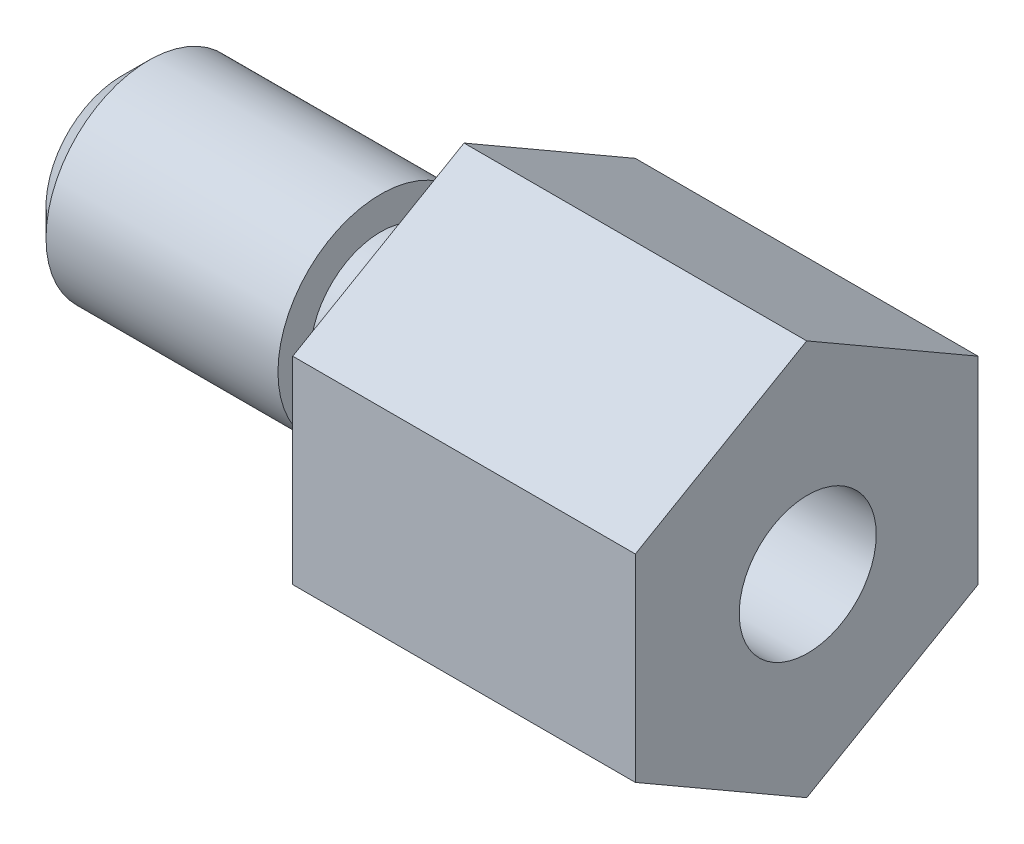
ISO-10303-21;
HEADER;
FILE_DESCRIPTION(('STEP AP214'),'2;1');
FILE_NAME('part.step','',(''),(''),'','','');
FILE_SCHEMA(('AUTOMOTIVE_DESIGN { 1 0 10303 214 1 1 1 1 }'));
ENDSEC;
DATA;
#1=APPLICATION_CONTEXT('core data for automotive mechanical design processes');
#2=APPLICATION_PROTOCOL_DEFINITION('international standard','automotive_design',2000,#1);
#3=PRODUCT_CONTEXT('',#1,'mechanical');
#4=PRODUCT('Part','Part','',(#3));
#5=PRODUCT_RELATED_PRODUCT_CATEGORY('part','',(#4));
#6=PRODUCT_DEFINITION_FORMATION('','',#4);
#7=PRODUCT_DEFINITION_CONTEXT('part definition',#1,'design');
#8=PRODUCT_DEFINITION('design','',#6,#7);
#9=PRODUCT_DEFINITION_SHAPE('','',#8);
#10=(LENGTH_UNIT() NAMED_UNIT(*) SI_UNIT(.MILLI.,.METRE.));
#11=(NAMED_UNIT(*) PLANE_ANGLE_UNIT() SI_UNIT($,.RADIAN.));
#12=(NAMED_UNIT(*) SI_UNIT($,.STERADIAN.) SOLID_ANGLE_UNIT());
#13=UNCERTAINTY_MEASURE_WITH_UNIT(LENGTH_MEASURE(1.E-05),#10,'distance_accuracy_value','');
#14=(GEOMETRIC_REPRESENTATION_CONTEXT(3) GLOBAL_UNCERTAINTY_ASSIGNED_CONTEXT((#13)) GLOBAL_UNIT_ASSIGNED_CONTEXT((#10,
#11,#12)) REPRESENTATION_CONTEXT('',''));
#15=CARTESIAN_POINT('',(0.,0.,0.));
#16=DIRECTION('',(0.,0.,1.));
#17=DIRECTION('',(1.,0.,0.));
#18=AXIS2_PLACEMENT_3D('',#15,#16,#17);
#19=CARTESIAN_POINT('',(5.,2.8867513453525,7.0548752704807E-10));
#20=DIRECTION('',(0.,0.866025403784439,-0.5));
#21=DIRECTION('',(0.,0.5,0.866025403784439));
#22=AXIS2_PLACEMENT_3D('',#19,#20,#21);
#23=PLANE('',#22);
#24=DIRECTION('',(0.,-0.5,-0.866025403784439));
#25=VECTOR('',#24,1.);
#26=CARTESIAN_POINT('',(0.,2.8867513453525,7.0548752704807E-10));
#27=LINE('',#26,#25);
#28=CARTESIAN_POINT('',(0.,2.8867513453525,7.0548752704807E-10));
#29=VERTEX_POINT('',#28);
#30=CARTESIAN_POINT('',(0.,1.44337567207295,-2.49999999982363));
#31=VERTEX_POINT('',#30);
#32=EDGE_CURVE('E128',#29,#31,#27,.T.);
#33=ORIENTED_EDGE('',*,*,#32,.F.);
#34=DIRECTION('',(-1.,0.,0.));
#35=VECTOR('',#34,1.);
#36=CARTESIAN_POINT('',(5.,2.8867513453525,7.0548752704807E-10));
#37=LINE('',#36,#35);
#38=CARTESIAN_POINT('',(5.,2.8867513453525,7.0548752704807E-10));
#39=VERTEX_POINT('',#38);
#40=EDGE_CURVE('E134',#39,#29,#37,.T.);
#41=ORIENTED_EDGE('',*,*,#40,.F.);
#42=DIRECTION('',(0.,-0.5,-0.866025403784439));
#43=VECTOR('',#42,1.);
#44=CARTESIAN_POINT('',(5.,2.8867513453525,7.0548752704807E-10));
#45=LINE('',#44,#43);
#46=CARTESIAN_POINT('',(5.,1.44337567207295,-2.49999999982363));
#47=VERTEX_POINT('',#46);
#48=EDGE_CURVE('E135',#39,#47,#45,.T.);
#49=ORIENTED_EDGE('',*,*,#48,.T.);
#50=DIRECTION('',(-1.,0.,0.));
#51=VECTOR('',#50,1.);
#52=CARTESIAN_POINT('',(5.,1.44337567207295,-2.49999999982363));
#53=LINE('',#52,#51);
#54=EDGE_CURVE('E154',#47,#31,#53,.T.);
#55=ORIENTED_EDGE('',*,*,#54,.T.);
#56=EDGE_LOOP('',(#33,#41,#49,#55));
#57=FACE_BOUND('',#56,.T.);
#58=ADVANCED_FACE('F33',(#57),#23,.T.);
#59=CARTESIAN_POINT('',(5.,1.44337567268392,2.50000000017637));
#60=DIRECTION('',(0.,0.866025403784439,0.5));
#61=DIRECTION('',(0.,-0.5,0.866025403784439));
#62=AXIS2_PLACEMENT_3D('',#59,#60,#61);
#63=PLANE('',#62);
#64=DIRECTION('',(0.,0.5,-0.866025403784439));
#65=VECTOR('',#64,1.);
#66=CARTESIAN_POINT('',(0.,1.44337567268392,2.50000000017637));
#67=LINE('',#66,#65);
#68=CARTESIAN_POINT('',(0.,1.44337567268392,2.50000000017637));
#69=VERTEX_POINT('',#68);
#70=EDGE_CURVE('E139',#69,#29,#67,.T.);
#71=ORIENTED_EDGE('',*,*,#70,.F.);
#72=DIRECTION('',(-1.,0.,0.));
#73=VECTOR('',#72,1.);
#74=CARTESIAN_POINT('',(5.,1.44337567268392,2.50000000017637));
#75=LINE('',#74,#73);
#76=CARTESIAN_POINT('',(5.,1.44337567268392,2.50000000017637));
#77=VERTEX_POINT('',#76);
#78=EDGE_CURVE('E172',#77,#69,#75,.T.);
#79=ORIENTED_EDGE('',*,*,#78,.F.);
#80=DIRECTION('',(0.,0.5,-0.866025403784439));
#81=VECTOR('',#80,1.);
#82=CARTESIAN_POINT('',(5.,1.44337567268392,2.50000000017637));
#83=LINE('',#82,#81);
#84=EDGE_CURVE('E151',#77,#39,#83,.T.);
#85=ORIENTED_EDGE('',*,*,#84,.T.);
#86=ORIENTED_EDGE('',*,*,#40,.T.);
#87=EDGE_LOOP('',(#71,#79,#85,#86));
#88=FACE_BOUND('',#87,.T.);
#89=ADVANCED_FACE('F210',(#88),#63,.T.);
#90=CARTESIAN_POINT('',(5.,-1.44337567307589,2.50000000017637));
#91=DIRECTION('',(0.,0.,1.));
#92=DIRECTION('',(0.,-1.,0.));
#93=AXIS2_PLACEMENT_3D('',#90,#91,#92);
#94=PLANE('',#93);
#95=DIRECTION('',(0.,1.,0.));
#96=VECTOR('',#95,1.);
#97=CARTESIAN_POINT('',(0.,-1.44337567307589,2.50000000017637));
#98=LINE('',#97,#96);
#99=CARTESIAN_POINT('',(0.,-1.44337567307589,2.50000000017637));
#100=VERTEX_POINT('',#99);
#101=EDGE_CURVE('E166',#100,#69,#98,.T.);
#102=ORIENTED_EDGE('',*,*,#101,.F.);
#103=DIRECTION('',(-1.,0.,0.));
#104=VECTOR('',#103,1.);
#105=CARTESIAN_POINT('',(5.,-1.44337567307589,2.50000000017637));
#106=LINE('',#105,#104);
#107=CARTESIAN_POINT('',(5.,-1.44337567307589,2.50000000017637));
#108=VERTEX_POINT('',#107);
#109=EDGE_CURVE('E174',#108,#100,#106,.T.);
#110=ORIENTED_EDGE('',*,*,#109,.F.);
#111=DIRECTION('',(0.,1.,0.));
#112=VECTOR('',#111,1.);
#113=CARTESIAN_POINT('',(5.,-1.44337567307589,2.50000000017637));
#114=LINE('',#113,#112);
#115=EDGE_CURVE('E148',#108,#77,#114,.T.);
#116=ORIENTED_EDGE('',*,*,#115,.T.);
#117=ORIENTED_EDGE('',*,*,#78,.T.);
#118=EDGE_LOOP('',(#102,#110,#116,#117));
#119=FACE_BOUND('',#118,.T.);
#120=ADVANCED_FACE('F213',(#119),#94,.T.);
#121=CARTESIAN_POINT('',(5.,-2.88675134696641,7.05487527048071E-10));
#122=DIRECTION('',(0.,-0.866025403601148,0.500000000317469));
#123=DIRECTION('',(0.,-0.500000000317469,-0.866025403601148));
#124=AXIS2_PLACEMENT_3D('',#121,#122,#123);
#125=PLANE('',#124);
#126=DIRECTION('',(0.,0.500000000317469,0.866025403601148));
#127=VECTOR('',#126,1.);
#128=CARTESIAN_POINT('',(0.,-2.88675134696641,7.05487527048071E-10));
#129=LINE('',#128,#127);
#130=CARTESIAN_POINT('',(0.,-2.88675134696641,7.05487527048071E-10));
#131=VERTEX_POINT('',#130);
#132=EDGE_CURVE('E163',#131,#100,#129,.T.);
#133=ORIENTED_EDGE('',*,*,#132,.F.);
#134=DIRECTION('',(-1.,0.,0.));
#135=VECTOR('',#134,1.);
#136=CARTESIAN_POINT('',(5.,-2.88675134696641,7.05487527048071E-10));
#137=LINE('',#136,#135);
#138=CARTESIAN_POINT('',(5.,-2.88675134696641,7.05487527048071E-10));
#139=VERTEX_POINT('',#138);
#140=EDGE_CURVE('E176',#139,#131,#137,.T.);
#141=ORIENTED_EDGE('',*,*,#140,.F.);
#142=DIRECTION('',(0.,0.500000000317469,0.866025403601148));
#143=VECTOR('',#142,1.);
#144=CARTESIAN_POINT('',(5.,-2.88675134696641,7.05487527048071E-10));
#145=LINE('',#144,#143);
#146=EDGE_CURVE('E145',#139,#108,#145,.T.);
#147=ORIENTED_EDGE('',*,*,#146,.T.);
#148=ORIENTED_EDGE('',*,*,#109,.T.);
#149=EDGE_LOOP('',(#133,#141,#147,#148));
#150=FACE_BOUND('',#149,.T.);
#151=ADVANCED_FACE('F217',(#150),#125,.T.);
#152=CARTESIAN_POINT('',(5.,-1.44337567368686,-2.49999999982363));
#153=DIRECTION('',(0.,-0.866025403784439,-0.5));
#154=DIRECTION('',(0.,0.5,-0.866025403784439));
#155=AXIS2_PLACEMENT_3D('',#152,#153,#154);
#156=PLANE('',#155);
#157=DIRECTION('',(0.,-0.5,0.866025403784439));
#158=VECTOR('',#157,1.);
#159=CARTESIAN_POINT('',(0.,-1.44337567368686,-2.49999999982363));
#160=LINE('',#159,#158);
#161=CARTESIAN_POINT('',(0.,-1.44337567368686,-2.49999999982363));
#162=VERTEX_POINT('',#161);
#163=EDGE_CURVE('E160',#162,#131,#160,.T.);
#164=ORIENTED_EDGE('',*,*,#163,.F.);
#165=DIRECTION('',(-1.,0.,0.));
#166=VECTOR('',#165,1.);
#167=CARTESIAN_POINT('',(5.,-1.44337567368686,-2.49999999982363));
#168=LINE('',#167,#166);
#169=CARTESIAN_POINT('',(5.,-1.44337567368686,-2.49999999982363));
#170=VERTEX_POINT('',#169);
#171=EDGE_CURVE('E178',#170,#162,#168,.T.);
#172=ORIENTED_EDGE('',*,*,#171,.F.);
#173=DIRECTION('',(0.,-0.5,0.866025403784439));
#174=VECTOR('',#173,1.);
#175=CARTESIAN_POINT('',(5.,-1.44337567368686,-2.49999999982363));
#176=LINE('',#175,#174);
#177=EDGE_CURVE('E142',#170,#139,#176,.T.);
#178=ORIENTED_EDGE('',*,*,#177,.T.);
#179=ORIENTED_EDGE('',*,*,#140,.T.);
#180=EDGE_LOOP('',(#164,#172,#178,#179));
#181=FACE_BOUND('',#180,.T.);
#182=ADVANCED_FACE('F221',(#181),#156,.T.);
#183=CARTESIAN_POINT('',(5.,1.44337567207295,-2.49999999982363));
#184=DIRECTION('',(0.,0.,-1.));
#185=DIRECTION('',(-1.,0.,0.));
#186=AXIS2_PLACEMENT_3D('',#183,#184,#185);
#187=PLANE('',#186);
#188=DIRECTION('',(0.,-1.,0.));
#189=VECTOR('',#188,1.);
#190=CARTESIAN_POINT('',(0.,1.44337567207295,-2.49999999982363));
#191=LINE('',#190,#189);
#192=EDGE_CURVE('E157',#31,#162,#191,.T.);
#193=ORIENTED_EDGE('',*,*,#192,.F.);
#194=ORIENTED_EDGE('',*,*,#54,.F.);
#195=DIRECTION('',(0.,-1.,0.));
#196=VECTOR('',#195,1.);
#197=CARTESIAN_POINT('',(5.,1.44337567207295,-2.49999999982363));
#198=LINE('',#197,#196);
#199=EDGE_CURVE('E138',#47,#170,#198,.T.);
#200=ORIENTED_EDGE('',*,*,#199,.T.);
#201=ORIENTED_EDGE('',*,*,#171,.T.);
#202=EDGE_LOOP('',(#193,#194,#200,#201));
#203=FACE_BOUND('',#202,.T.);
#204=ADVANCED_FACE('F205',(#203),#187,.T.);
#205=CARTESIAN_POINT('',(5.,0.,0.));
#206=DIRECTION('',(-1.,0.,0.));
#207=DIRECTION('',(0.,0.,1.));
#208=AXIS2_PLACEMENT_3D('',#205,#206,#207);
#209=PLANE('',#208);
#210=CARTESIAN_POINT('',(5.,-0.068295067,-0.0152284159999954));
#211=DIRECTION('',(1.,0.,0.));
#212=DIRECTION('',(0.,0.,-1.));
#213=AXIS2_PLACEMENT_3D('',#210,#211,#212);
#214=CIRCLE('',#213,0.999999999999999);
#215=CARTESIAN_POINT('',(5.,-0.068295067,-1.01522841599999));
#216=VERTEX_POINT('',#215);
#217=EDGE_CURVE('E335',#216,#216,#214,.T.);
#218=ORIENTED_EDGE('',*,*,#217,.F.);
#219=EDGE_LOOP('',(#218));
#220=FACE_BOUND('',#219,.T.);
#221=ORIENTED_EDGE('',*,*,#48,.F.);
#222=ORIENTED_EDGE('',*,*,#84,.F.);
#223=ORIENTED_EDGE('',*,*,#115,.F.);
#224=ORIENTED_EDGE('',*,*,#146,.F.);
#225=ORIENTED_EDGE('',*,*,#177,.F.);
#226=ORIENTED_EDGE('',*,*,#199,.F.);
#227=EDGE_LOOP('',(#221,#222,#223,#224,#225,#226));
#228=FACE_BOUND('',#227,.T.);
#229=ADVANCED_FACE('F202',(#220,#228),#209,.F.);
#230=CARTESIAN_POINT('',(0.,0.,0.));
#231=DIRECTION('',(-1.,0.,0.));
#232=DIRECTION('',(0.,0.,1.));
#233=AXIS2_PLACEMENT_3D('',#230,#231,#232);
#234=PLANE('',#233);
#235=CARTESIAN_POINT('',(0.,-0.068295067,-0.0152284159999944));
#236=DIRECTION('',(-1.,0.,0.));
#237=DIRECTION('',(0.,0.,1.));
#238=AXIS2_PLACEMENT_3D('',#235,#236,#237);
#239=CIRCLE('',#238,0.999999999999998);
#240=CARTESIAN_POINT('',(0.,-0.0139194785297091,-1.01374896930799));
#241=VERTEX_POINT('',#240);
#242=CARTESIAN_POINT('',(0.,-0.164517433031087,0.980131446700615));
#243=VERTEX_POINT('',#242);
#244=EDGE_CURVE('E125',#241,#243,#239,.T.);
#245=ORIENTED_EDGE('',*,*,#244,.F.);
#246=CARTESIAN_POINT('',(0.,0.133325469811099,0.));
#247=DIRECTION('',(-1.,0.,0.));
#248=DIRECTION('',(0.,0.,1.));
#249=AXIS2_PLACEMENT_3D('',#246,#247,#248);
#250=CIRCLE('',#249,1.02438666898047);
#251=EDGE_CURVE('E113',#243,#241,#250,.T.);
#252=ORIENTED_EDGE('',*,*,#251,.F.);
#253=EDGE_LOOP('',(#245,#252));
#254=FACE_BOUND('',#253,.T.);
#255=ORIENTED_EDGE('',*,*,#32,.T.);
#256=ORIENTED_EDGE('',*,*,#192,.T.);
#257=ORIENTED_EDGE('',*,*,#163,.T.);
#258=ORIENTED_EDGE('',*,*,#132,.T.);
#259=ORIENTED_EDGE('',*,*,#101,.T.);
#260=ORIENTED_EDGE('',*,*,#70,.T.);
#261=EDGE_LOOP('',(#255,#256,#257,#258,#259,#260));
#262=FACE_BOUND('',#261,.T.);
#263=ADVANCED_FACE('F201',(#254,#262),#234,.T.);
#264=CARTESIAN_POINT('',(0.,0.133325469811099,0.));
#265=DIRECTION('',(-1.,0.,0.));
#266=DIRECTION('',(0.,0.,1.));
#267=AXIS2_PLACEMENT_3D('',#264,#265,#266);
#268=CYLINDRICAL_SURFACE('',#267,1.02438666898047);
#269=DIRECTION('',(1.,0.,0.));
#270=VECTOR('',#269,1.);
#271=CARTESIAN_POINT('',(0.,-0.164517433031086,0.980131446700615));
#272=LINE('',#271,#270);
#273=CARTESIAN_POINT('',(-1.21535033298414,-0.164517433031085,0.980131446700615));
#274=VERTEX_POINT('',#273);
#275=EDGE_CURVE('E108',#243,#274,#272,.F.);
#276=ORIENTED_EDGE('',*,*,#275,.F.);
#277=ORIENTED_EDGE('',*,*,#251,.T.);
#278=DIRECTION('',(1.,0.,0.));
#279=VECTOR('',#278,1.);
#280=CARTESIAN_POINT('',(0.,-0.0139194785297094,-1.01374896930799));
#281=LINE('',#280,#279);
#282=CARTESIAN_POINT('',(-1.21535033298414,-0.0139194785297105,-1.01374896930799));
#283=VERTEX_POINT('',#282);
#284=EDGE_CURVE('E105',#283,#241,#281,.T.);
#285=ORIENTED_EDGE('',*,*,#284,.F.);
#286=CARTESIAN_POINT('',(-1.21535033298414,0.133325469811099,0.));
#287=DIRECTION('',(-1.,0.,0.));
#288=DIRECTION('',(0.,0.,1.));
#289=AXIS2_PLACEMENT_3D('',#286,#287,#288);
#290=CIRCLE('',#289,1.02438666898047);
#291=EDGE_CURVE('E118',#274,#283,#290,.T.);
#292=ORIENTED_EDGE('',*,*,#291,.F.);
#293=EDGE_LOOP('',(#276,#277,#285,#292));
#294=FACE_BOUND('',#293,.T.);
#295=ADVANCED_FACE('F117',(#294),#268,.T.);
#296=CARTESIAN_POINT('',(-5.,0.133325469811099,0.));
#297=DIRECTION('',(-1.,0.,0.));
#298=DIRECTION('',(0.,0.,1.));
#299=AXIS2_PLACEMENT_3D('',#296,#297,#298);
#300=PLANE('',#299);
#301=CARTESIAN_POINT('',(-5.,-0.068295067,-0.0152284159999935));
#302=DIRECTION('',(1.,0.,0.));
#303=DIRECTION('',(0.,0.,-1.));
#304=AXIS2_PLACEMENT_3D('',#301,#302,#303);
#305=CIRCLE('',#304,0.999999999999997);
#306=CARTESIAN_POINT('',(-5.,-0.416897855262242,-0.952498972464767));
#307=VERTEX_POINT('',#306);
#308=CARTESIAN_POINT('',(-5.,-0.553724122759844,0.859047645564145));
#309=VERTEX_POINT('',#308);
#310=EDGE_CURVE('E120',#307,#309,#305,.T.);
#311=ORIENTED_EDGE('',*,*,#310,.T.);
#312=CARTESIAN_POINT('',(-5.,0.133325469811099,0.));
#313=DIRECTION('',(-1.,0.,0.));
#314=DIRECTION('',(0.,0.,1.));
#315=AXIS2_PLACEMENT_3D('',#312,#313,#314);
#316=CIRCLE('',#315,1.10000000000054);
#317=EDGE_CURVE('E112',#309,#307,#316,.T.);
#318=ORIENTED_EDGE('',*,*,#317,.T.);
#319=EDGE_LOOP('',(#311,#318));
#320=FACE_BOUND('',#319,.T.);
#321=ADVANCED_FACE('F194',(#320),#300,.T.);
#322=CARTESIAN_POINT('',(0.,0.133325469811099,0.));
#323=DIRECTION('',(-1.,0.,0.));
#324=DIRECTION('',(0.,0.,1.));
#325=AXIS2_PLACEMENT_3D('',#322,#323,#324);
#326=CYLINDRICAL_SURFACE('',#325,1.5);
#327=CARTESIAN_POINT('',(-4.60000000000054,0.133325469811099,0.));
#328=DIRECTION('',(-1.,0.,0.));
#329=DIRECTION('',(0.,0.,1.));
#330=AXIS2_PLACEMENT_3D('',#327,#328,#329);
#331=CIRCLE('',#330,1.5);
#332=CARTESIAN_POINT('',(-4.60000000000054,0.133325469811099,1.5));
#333=VERTEX_POINT('',#332);
#334=EDGE_CURVE('E11',#333,#333,#331,.F.);
#335=ORIENTED_EDGE('',*,*,#334,.T.);
#336=EDGE_LOOP('',(#335));
#337=FACE_BOUND('',#336,.T.);
#338=CARTESIAN_POINT('',(-1.21535033298414,0.133325469811099,0.));
#339=DIRECTION('',(-1.,0.,0.));
#340=DIRECTION('',(0.,0.,1.));
#341=AXIS2_PLACEMENT_3D('',#338,#339,#340);
#342=CIRCLE('',#341,1.5);
#343=CARTESIAN_POINT('',(-1.21535033298414,0.133325469811099,1.5));
#344=VERTEX_POINT('',#343);
#345=EDGE_CURVE('E124',#344,#344,#342,.T.);
#346=ORIENTED_EDGE('',*,*,#345,.T.);
#347=EDGE_LOOP('',(#346));
#348=FACE_BOUND('',#347,.T.);
#349=ADVANCED_FACE('F191',(#337,#348),#326,.T.);
#350=CARTESIAN_POINT('',(-1.21535033298414,1.6333254698111,0.));
#351=DIRECTION('',(1.,0.,0.));
#352=DIRECTION('',(0.,0.,-1.));
#353=AXIS2_PLACEMENT_3D('',#350,#351,#352);
#354=PLANE('',#353);
#355=CARTESIAN_POINT('',(-1.21535033298414,-0.068295067,-0.0152284159999942));
#356=DIRECTION('',(1.,0.,0.));
#357=DIRECTION('',(0.,0.,-1.));
#358=AXIS2_PLACEMENT_3D('',#355,#356,#357);
#359=CIRCLE('',#358,0.999999999999998);
#360=EDGE_CURVE('E102',#274,#283,#359,.T.);
#361=ORIENTED_EDGE('',*,*,#360,.F.);
#362=ORIENTED_EDGE('',*,*,#291,.T.);
#363=EDGE_LOOP('',(#361,#362));
#364=FACE_BOUND('',#363,.T.);
#365=ORIENTED_EDGE('',*,*,#345,.F.);
#366=EDGE_LOOP('',(#365));
#367=FACE_BOUND('',#366,.T.);
#368=ADVANCED_FACE('F122',(#364,#367),#354,.T.);
#369=CARTESIAN_POINT('',(5.,-0.068295067,-0.0152284159999954));
#370=DIRECTION('',(1.,0.,0.));
#371=DIRECTION('',(0.,0.,-1.));
#372=AXIS2_PLACEMENT_3D('',#369,#370,#371);
#373=CYLINDRICAL_SURFACE('',#372,0.999999999999998);
#374=ORIENTED_EDGE('',*,*,#244,.T.);
#375=ORIENTED_EDGE('',*,*,#275,.T.);
#376=ORIENTED_EDGE('',*,*,#360,.T.);
#377=ORIENTED_EDGE('',*,*,#284,.T.);
#378=EDGE_LOOP('',(#374,#375,#376,#377));
#379=FACE_BOUND('',#378,.T.);
#380=ORIENTED_EDGE('',*,*,#310,.F.);
#381=CARTESIAN_POINT('',(-5.00000000000001,-0.416897855262242,-0.952498972464767));
#382=CARTESIAN_POINT('',(-4.99099853664424,-0.467419778216342,-0.933750895570503));
#383=CARTESIAN_POINT('',(-4.9824383748933,-0.516461572821841,-0.910822072384985));
#384=CARTESIAN_POINT('',(-4.96634396865603,-0.610358849982586,-0.857289491230948));
#385=CARTESIAN_POINT('',(-4.95880994287277,-0.655213439468892,-0.826684101072909));
#386=CARTESIAN_POINT('',(-4.94460171557328,-0.741388277229676,-0.756955655310423));
#387=CARTESIAN_POINT('',(-4.93798162358799,-0.782457856712162,-0.717510677840581));
#388=CARTESIAN_POINT('',(-4.92615986144775,-0.857387111961065,-0.632121996623778));
#389=CARTESIAN_POINT('',(-4.92095771158471,-0.891249225254561,-0.586180498742227));
#390=CARTESIAN_POINT('',(-4.91213886996541,-0.950293204973665,-0.489808894722043));
#391=CARTESIAN_POINT('',(-4.9085002571164,-0.97559395338932,-0.43945363691199));
#392=CARTESIAN_POINT('',(-4.9027711732213,-1.01741149737264,-0.335128299915799));
#393=CARTESIAN_POINT('',(-4.90068083725771,-1.03392752646456,-0.281157905767729));
#394=CARTESIAN_POINT('',(-4.8981041463438,-1.05753341634784,-0.171768430425844));
#395=CARTESIAN_POINT('',(-4.8976007270665,-1.06472306692127,-0.116371265255935));
#396=CARTESIAN_POINT('',(-4.89815931021534,-1.06979223148222,-0.00516266306338678));
#397=CARTESIAN_POINT('',(-4.89922123007568,-1.06767223650714,0.0506487519546262));
#398=CARTESIAN_POINT('',(-4.90288330533656,-1.05422271063968,0.160896142951464));
#399=CARTESIAN_POINT('',(-4.90547800548138,-1.04292578774756,0.215336286418071));
#400=CARTESIAN_POINT('',(-4.9121513573534,-1.01151888203078,0.32151101484256));
#401=CARTESIAN_POINT('',(-4.91622991623258,-0.991409450606327,0.373245768850475));
#402=CARTESIAN_POINT('',(-4.92581369268023,-0.942887139500902,0.472797005751857));
#403=CARTESIAN_POINT('',(-4.93132508006463,-0.914438280619996,0.520595336331534));
#404=CARTESIAN_POINT('',(-4.94366127086147,-0.850117953670741,0.610725080660162));
#405=CARTESIAN_POINT('',(-4.95048614320174,-0.814246096057843,0.653056207311453));
#406=CARTESIAN_POINT('',(-4.96414604455832,-0.74229983881039,0.724961655427455));
#407=CARTESIAN_POINT('',(-4.97081075570258,-0.707144090327997,0.755495249675809));
#408=CARTESIAN_POINT('',(-4.98487596746403,-0.633076786838081,0.811318408171267));
#409=CARTESIAN_POINT('',(-4.99227575493511,-0.594168873103914,0.836612983022412));
#410=CARTESIAN_POINT('',(-5.,-0.553724122759844,0.859047645564145));
#411=B_SPLINE_CURVE_WITH_KNOTS('',3,(#381,#382,#383,#384,#385,#386,#387,#388,#389,#390,#391,
#392,#393,#394,#395,#396,#397,#398,#399,#400,#401,#402,#403,#404,#405,#406,#407,#408,#409,#410),
.UNSPECIFIED.,.F.,.F.,(4,2,2,2,2,2,2,2,2,2,2,2,2,2,4),(0.,0.163720052871008,0.327474945405649,
0.498615946582382,0.669698976485419,0.838298237133807,1.00691220582812,1.17370675004695,
1.34049249679084,1.50668818945919,1.67287348471826,1.83978658740646,2.00670845159229,
2.14738508221277,2.28792654186341),.UNSPECIFIED.);
#412=EDGE_CURVE('E42',#307,#309,#411,.T.);
#413=ORIENTED_EDGE('',*,*,#412,.T.);
#414=EDGE_LOOP('',(#380,#413));
#415=FACE_BOUND('',#414,.T.);
#416=ORIENTED_EDGE('',*,*,#217,.T.);
#417=EDGE_LOOP('',(#416));
#418=FACE_BOUND('',#417,.T.);
#419=ADVANCED_FACE('F104',(#379,#415,#418),#373,.F.);
#420=CARTESIAN_POINT('',(-5.,0.133325469811099,0.));
#421=DIRECTION('',(1.,0.,0.));
#422=DIRECTION('',(0.,0.,-1.));
#423=AXIS2_PLACEMENT_3D('',#420,#421,#422);
#424=CONICAL_SURFACE('',#423,1.10000000000054,0.785398163397445);
#425=ORIENTED_EDGE('',*,*,#334,.F.);
#426=EDGE_LOOP('',(#425));
#427=FACE_BOUND('',#426,.T.);
#428=ORIENTED_EDGE('',*,*,#412,.F.);
#429=ORIENTED_EDGE('',*,*,#317,.F.);
#430=EDGE_LOOP('',(#428,#429));
#431=FACE_BOUND('',#430,.T.);
#432=ADVANCED_FACE('F35',(#427,#431),#424,.T.);
#433=CLOSED_SHELL('',(#58,#89,#120,#151,#182,#204,#229,#263,#295,#321,#349,#368,#419,#432));
#434=MANIFOLD_SOLID_BREP('B2',#433);
#435=ADVANCED_BREP_SHAPE_REPRESENTATION('',(#18,#434),#14);
#436=SHAPE_DEFINITION_REPRESENTATION(#9,#435);
ENDSEC;
END-ISO-10303-21;
